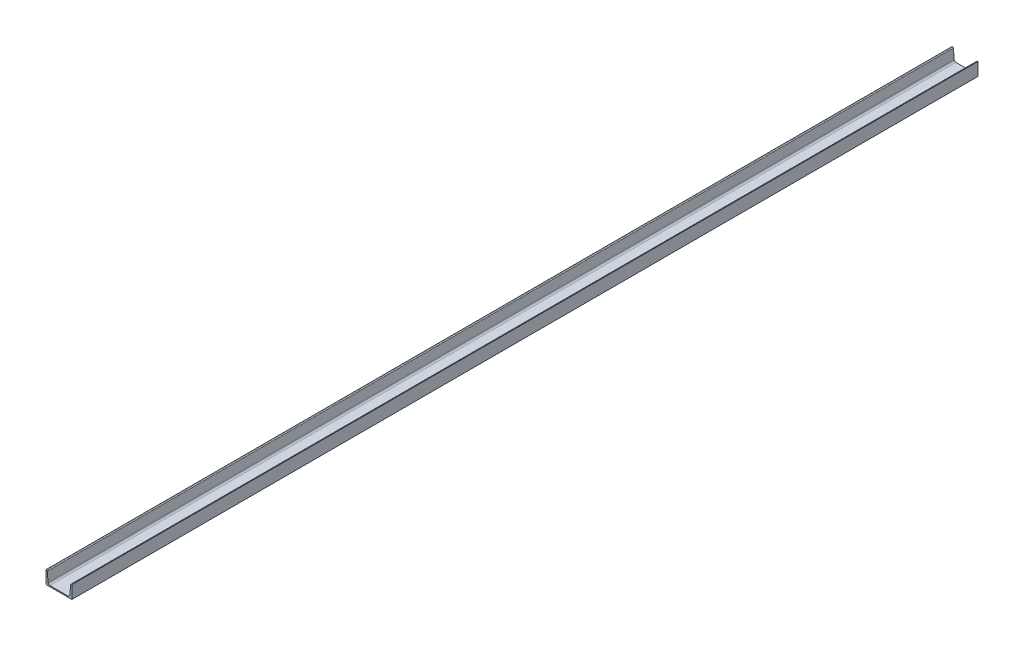
ISO-10303-21;
HEADER;
FILE_DESCRIPTION(('STEP AP214'),'2;1');
FILE_NAME('part.step','',(''),(''),'','','');
FILE_SCHEMA(('AUTOMOTIVE_DESIGN { 1 0 10303 214 1 1 1 1 }'));
ENDSEC;
DATA;
#1=APPLICATION_CONTEXT('core data for automotive mechanical design processes');
#2=APPLICATION_PROTOCOL_DEFINITION('international standard','automotive_design',2000,#1);
#3=PRODUCT_CONTEXT('',#1,'mechanical');
#4=PRODUCT('Part','Part','',(#3));
#5=PRODUCT_RELATED_PRODUCT_CATEGORY('part','',(#4));
#6=PRODUCT_DEFINITION_FORMATION('','',#4);
#7=PRODUCT_DEFINITION_CONTEXT('part definition',#1,'design');
#8=PRODUCT_DEFINITION('design','',#6,#7);
#9=PRODUCT_DEFINITION_SHAPE('','',#8);
#10=(LENGTH_UNIT() NAMED_UNIT(*) SI_UNIT(.MILLI.,.METRE.));
#11=(NAMED_UNIT(*) PLANE_ANGLE_UNIT() SI_UNIT($,.RADIAN.));
#12=(NAMED_UNIT(*) SI_UNIT($,.STERADIAN.) SOLID_ANGLE_UNIT());
#13=UNCERTAINTY_MEASURE_WITH_UNIT(LENGTH_MEASURE(1.E-05),#10,'distance_accuracy_value','');
#14=(GEOMETRIC_REPRESENTATION_CONTEXT(3) GLOBAL_UNCERTAINTY_ASSIGNED_CONTEXT((#13)) GLOBAL_UNIT_ASSIGNED_CONTEXT((#10,
#11,#12)) REPRESENTATION_CONTEXT('',''));
#15=CARTESIAN_POINT('',(0.,0.,0.));
#16=DIRECTION('',(0.,0.,1.));
#17=DIRECTION('',(1.,0.,0.));
#18=AXIS2_PLACEMENT_3D('',#15,#16,#17);
#19=CARTESIAN_POINT('',(147.57814259585,70.,-2625.));
#20=DIRECTION('',(0.,0.,1.));
#21=DIRECTION('',(1.,0.,0.));
#22=AXIS2_PLACEMENT_3D('',#19,#20,#21);
#23=CYLINDRICAL_SURFACE('',#22,4.99999999999999);
#24=CARTESIAN_POINT('',(147.57814259585,70.,2625.));
#25=DIRECTION('',(0.,0.,-1.));
#26=DIRECTION('',(-1.,0.,0.));
#27=AXIS2_PLACEMENT_3D('',#24,#25,#26);
#28=CIRCLE('',#27,4.99999999999999);
#29=CARTESIAN_POINT('',(142.597169105391,70.4357787137383,2625.));
#30=VERTEX_POINT('',#29);
#31=CARTESIAN_POINT('',(147.57814259585,75.,2625.));
#32=VERTEX_POINT('',#31);
#33=EDGE_CURVE('E195',#30,#32,#28,.T.);
#34=ORIENTED_EDGE('',*,*,#33,.T.);
#35=DIRECTION('',(0.,0.,1.));
#36=VECTOR('',#35,1.);
#37=CARTESIAN_POINT('',(147.57814259585,75.,-2625.));
#38=LINE('',#37,#36);
#39=CARTESIAN_POINT('',(147.57814259585,75.,-2625.));
#40=VERTEX_POINT('',#39);
#41=EDGE_CURVE('E13',#40,#32,#38,.T.);
#42=ORIENTED_EDGE('',*,*,#41,.F.);
#43=CARTESIAN_POINT('',(147.57814259585,70.,-2625.));
#44=DIRECTION('',(0.,0.,-1.));
#45=DIRECTION('',(-1.,0.,0.));
#46=AXIS2_PLACEMENT_3D('',#43,#44,#45);
#47=CIRCLE('',#46,4.99999999999999);
#48=CARTESIAN_POINT('',(142.597169105391,70.4357787137383,-2625.));
#49=VERTEX_POINT('',#48);
#50=EDGE_CURVE('E217',#49,#40,#47,.T.);
#51=ORIENTED_EDGE('',*,*,#50,.F.);
#52=DIRECTION('',(0.,0.,1.));
#53=VECTOR('',#52,1.);
#54=CARTESIAN_POINT('',(142.597169105391,70.4357787137383,-2625.));
#55=LINE('',#54,#53);
#56=EDGE_CURVE('E191',#49,#30,#55,.T.);
#57=ORIENTED_EDGE('',*,*,#56,.T.);
#58=EDGE_LOOP('',(#34,#42,#51,#57));
#59=FACE_BOUND('',#58,.T.);
#60=ADVANCED_FACE('F75',(#59),#23,.T.);
#61=CARTESIAN_POINT('',(150.,75.,-2625.));
#62=DIRECTION('',(0.,-1.,0.));
#63=DIRECTION('',(0.,0.,-1.));
#64=AXIS2_PLACEMENT_3D('',#61,#62,#63);
#65=PLANE('',#64);
#66=DIRECTION('',(1.,0.,0.));
#67=VECTOR('',#66,1.);
#68=CARTESIAN_POINT('',(150.,75.,2625.));
#69=LINE('',#68,#67);
#70=CARTESIAN_POINT('',(150.,75.,2625.));
#71=VERTEX_POINT('',#70);
#72=EDGE_CURVE('E198',#32,#71,#69,.T.);
#73=ORIENTED_EDGE('',*,*,#72,.T.);
#74=DIRECTION('',(0.,0.,1.));
#75=VECTOR('',#74,1.);
#76=CARTESIAN_POINT('',(150.,75.,-2625.));
#77=LINE('',#76,#75);
#78=CARTESIAN_POINT('',(150.,75.,-2625.));
#79=VERTEX_POINT('',#78);
#80=EDGE_CURVE('E83',#79,#71,#77,.T.);
#81=ORIENTED_EDGE('',*,*,#80,.F.);
#82=DIRECTION('',(1.,0.,0.));
#83=VECTOR('',#82,1.);
#84=CARTESIAN_POINT('',(150.,75.,-2625.));
#85=LINE('',#84,#83);
#86=EDGE_CURVE('E146',#40,#79,#85,.T.);
#87=ORIENTED_EDGE('',*,*,#86,.F.);
#88=ORIENTED_EDGE('',*,*,#41,.T.);
#89=EDGE_LOOP('',(#73,#81,#87,#88));
#90=FACE_BOUND('',#89,.T.);
#91=ADVANCED_FACE('F295',(#90),#65,.F.);
#92=CARTESIAN_POINT('',(150.,75.,-2625.));
#93=DIRECTION('',(-1.,0.,0.));
#94=DIRECTION('',(0.,0.,1.));
#95=AXIS2_PLACEMENT_3D('',#92,#93,#94);
#96=PLANE('',#95);
#97=DIRECTION('',(0.,-1.,0.));
#98=VECTOR('',#97,1.);
#99=CARTESIAN_POINT('',(150.,75.,2625.));
#100=LINE('',#99,#98);
#101=CARTESIAN_POINT('',(150.,0.,2625.));
#102=VERTEX_POINT('',#101);
#103=EDGE_CURVE('E200',#71,#102,#100,.T.);
#104=ORIENTED_EDGE('',*,*,#103,.T.);
#105=DIRECTION('',(0.,0.,1.));
#106=VECTOR('',#105,1.);
#107=CARTESIAN_POINT('',(150.,0.,-2625.));
#108=LINE('',#107,#106);
#109=CARTESIAN_POINT('',(150.,0.,-2625.));
#110=VERTEX_POINT('',#109);
#111=EDGE_CURVE('E236',#110,#102,#108,.T.);
#112=ORIENTED_EDGE('',*,*,#111,.F.);
#113=DIRECTION('',(0.,-1.,0.));
#114=VECTOR('',#113,1.);
#115=CARTESIAN_POINT('',(150.,75.,-2625.));
#116=LINE('',#115,#114);
#117=EDGE_CURVE('E244',#79,#110,#116,.T.);
#118=ORIENTED_EDGE('',*,*,#117,.F.);
#119=ORIENTED_EDGE('',*,*,#80,.T.);
#120=EDGE_LOOP('',(#104,#112,#118,#119));
#121=FACE_BOUND('',#120,.T.);
#122=ADVANCED_FACE('F242',(#121),#96,.F.);
#123=CARTESIAN_POINT('',(150.,0.,-2625.));
#124=DIRECTION('',(0.,1.,0.));
#125=DIRECTION('',(0.,0.,1.));
#126=AXIS2_PLACEMENT_3D('',#123,#124,#125);
#127=PLANE('',#126);
#128=DIRECTION('',(-1.,0.,0.));
#129=VECTOR('',#128,1.);
#130=CARTESIAN_POINT('',(150.,0.,2625.));
#131=LINE('',#130,#129);
#132=CARTESIAN_POINT('',(0.,0.,2625.));
#133=VERTEX_POINT('',#132);
#134=EDGE_CURVE('E202',#102,#133,#131,.T.);
#135=ORIENTED_EDGE('',*,*,#134,.T.);
#136=DIRECTION('',(0.,0.,1.));
#137=VECTOR('',#136,1.);
#138=CARTESIAN_POINT('',(0.,0.,-2625.));
#139=LINE('',#138,#137);
#140=CARTESIAN_POINT('',(0.,0.,-2625.));
#141=VERTEX_POINT('',#140);
#142=EDGE_CURVE('E233',#141,#133,#139,.T.);
#143=ORIENTED_EDGE('',*,*,#142,.F.);
#144=DIRECTION('',(-1.,0.,0.));
#145=VECTOR('',#144,1.);
#146=CARTESIAN_POINT('',(150.,0.,-2625.));
#147=LINE('',#146,#145);
#148=EDGE_CURVE('E262',#110,#141,#147,.T.);
#149=ORIENTED_EDGE('',*,*,#148,.F.);
#150=ORIENTED_EDGE('',*,*,#111,.T.);
#151=EDGE_LOOP('',(#135,#143,#149,#150));
#152=FACE_BOUND('',#151,.T.);
#153=ADVANCED_FACE('F253',(#152),#127,.F.);
#154=CARTESIAN_POINT('',(0.,75.,-2625.));
#155=DIRECTION('',(1.,0.,0.));
#156=DIRECTION('',(0.,1.,0.));
#157=AXIS2_PLACEMENT_3D('',#154,#155,#156);
#158=PLANE('',#157);
#159=DIRECTION('',(0.,1.,0.));
#160=VECTOR('',#159,1.);
#161=CARTESIAN_POINT('',(0.,75.,2625.));
#162=LINE('',#161,#160);
#163=CARTESIAN_POINT('',(0.,75.,2625.));
#164=VERTEX_POINT('',#163);
#165=EDGE_CURVE('E204',#133,#164,#162,.T.);
#166=ORIENTED_EDGE('',*,*,#165,.T.);
#167=DIRECTION('',(0.,0.,1.));
#168=VECTOR('',#167,1.);
#169=CARTESIAN_POINT('',(0.,75.,-2625.));
#170=LINE('',#169,#168);
#171=CARTESIAN_POINT('',(0.,75.,-2625.));
#172=VERTEX_POINT('',#171);
#173=EDGE_CURVE('E230',#172,#164,#170,.T.);
#174=ORIENTED_EDGE('',*,*,#173,.F.);
#175=DIRECTION('',(0.,1.,0.));
#176=VECTOR('',#175,1.);
#177=CARTESIAN_POINT('',(0.,75.,-2625.));
#178=LINE('',#177,#176);
#179=EDGE_CURVE('E259',#141,#172,#178,.T.);
#180=ORIENTED_EDGE('',*,*,#179,.F.);
#181=ORIENTED_EDGE('',*,*,#142,.T.);
#182=EDGE_LOOP('',(#166,#174,#180,#181));
#183=FACE_BOUND('',#182,.T.);
#184=ADVANCED_FACE('F257',(#183),#158,.F.);
#185=CARTESIAN_POINT('',(0.,75.,-2625.));
#186=DIRECTION('',(0.,-1.,0.));
#187=DIRECTION('',(0.,0.,-1.));
#188=AXIS2_PLACEMENT_3D('',#185,#186,#187);
#189=PLANE('',#188);
#190=DIRECTION('',(1.,0.,0.));
#191=VECTOR('',#190,1.);
#192=CARTESIAN_POINT('',(0.,75.,2625.));
#193=LINE('',#192,#191);
#194=CARTESIAN_POINT('',(2.42185740415013,75.,2625.));
#195=VERTEX_POINT('',#194);
#196=EDGE_CURVE('E206',#164,#195,#193,.T.);
#197=ORIENTED_EDGE('',*,*,#196,.T.);
#198=DIRECTION('',(0.,0.,1.));
#199=VECTOR('',#198,1.);
#200=CARTESIAN_POINT('',(2.42185740415013,75.,-2625.));
#201=LINE('',#200,#199);
#202=CARTESIAN_POINT('',(2.42185740415013,75.,-2625.));
#203=VERTEX_POINT('',#202);
#204=EDGE_CURVE('E227',#203,#195,#201,.T.);
#205=ORIENTED_EDGE('',*,*,#204,.F.);
#206=DIRECTION('',(1.,0.,0.));
#207=VECTOR('',#206,1.);
#208=CARTESIAN_POINT('',(0.,75.,-2625.));
#209=LINE('',#208,#207);
#210=EDGE_CURVE('E261',#172,#203,#209,.T.);
#211=ORIENTED_EDGE('',*,*,#210,.F.);
#212=ORIENTED_EDGE('',*,*,#173,.T.);
#213=EDGE_LOOP('',(#197,#205,#211,#212));
#214=FACE_BOUND('',#213,.T.);
#215=ADVANCED_FACE('F308',(#214),#189,.F.);
#216=CARTESIAN_POINT('',(2.42185740415013,70.,-2625.));
#217=DIRECTION('',(0.,0.,1.));
#218=DIRECTION('',(1.,0.,0.));
#219=AXIS2_PLACEMENT_3D('',#216,#217,#218);
#220=CYLINDRICAL_SURFACE('',#219,5.);
#221=CARTESIAN_POINT('',(2.42185740415013,70.,2625.));
#222=DIRECTION('',(0.,0.,-1.));
#223=DIRECTION('',(1.,0.,0.));
#224=AXIS2_PLACEMENT_3D('',#221,#222,#223);
#225=CIRCLE('',#224,5.);
#226=CARTESIAN_POINT('',(7.40283089460886,70.4357787137383,2625.));
#227=VERTEX_POINT('',#226);
#228=EDGE_CURVE('E208',#195,#227,#225,.T.);
#229=ORIENTED_EDGE('',*,*,#228,.T.);
#230=DIRECTION('',(0.,0.,1.));
#231=VECTOR('',#230,1.);
#232=CARTESIAN_POINT('',(7.40283089460886,70.4357787137383,-2625.));
#233=LINE('',#232,#231);
#234=CARTESIAN_POINT('',(7.40283089460886,70.4357787137383,-2625.));
#235=VERTEX_POINT('',#234);
#236=EDGE_CURVE('E224',#235,#227,#233,.T.);
#237=ORIENTED_EDGE('',*,*,#236,.F.);
#238=CARTESIAN_POINT('',(2.42185740415013,70.,-2625.));
#239=DIRECTION('',(0.,0.,-1.));
#240=DIRECTION('',(1.,0.,0.));
#241=AXIS2_PLACEMENT_3D('',#238,#239,#240);
#242=CIRCLE('',#241,5.);
#243=EDGE_CURVE('E264',#203,#235,#242,.T.);
#244=ORIENTED_EDGE('',*,*,#243,.F.);
#245=ORIENTED_EDGE('',*,*,#204,.T.);
#246=EDGE_LOOP('',(#229,#237,#244,#245));
#247=FACE_BOUND('',#246,.T.);
#248=ADVANCED_FACE('F311',(#247),#220,.T.);
#249=CARTESIAN_POINT('',(12.1978514850195,15.6284425725235,-2625.));
#250=DIRECTION('',(-0.996194698091746,-0.087155742747653,0.));
#251=DIRECTION('',(0.087155742747653,-0.996194698091746,0.));
#252=AXIS2_PLACEMENT_3D('',#249,#250,#251);
#253=PLANE('',#252);
#254=DIRECTION('',(0.087155742747653,-0.996194698091746,0.));
#255=VECTOR('',#254,1.);
#256=CARTESIAN_POINT('',(12.1978514850195,15.6284425725235,2625.));
#257=LINE('',#256,#255);
#258=CARTESIAN_POINT('',(12.1978514850195,15.6284425725235,2625.));
#259=VERTEX_POINT('',#258);
#260=EDGE_CURVE('E210',#227,#259,#257,.T.);
#261=ORIENTED_EDGE('',*,*,#260,.T.);
#262=DIRECTION('',(0.,0.,1.));
#263=VECTOR('',#262,1.);
#264=CARTESIAN_POINT('',(12.1978514850195,15.6284425725235,-2625.));
#265=LINE('',#264,#263);
#266=CARTESIAN_POINT('',(12.1978514850195,15.6284425725235,-2625.));
#267=VERTEX_POINT('',#266);
#268=EDGE_CURVE('E221',#267,#259,#265,.T.);
#269=ORIENTED_EDGE('',*,*,#268,.F.);
#270=DIRECTION('',(0.087155742747653,-0.996194698091746,0.));
#271=VECTOR('',#270,1.);
#272=CARTESIAN_POINT('',(12.1978514850195,15.6284425725235,-2625.));
#273=LINE('',#272,#271);
#274=EDGE_CURVE('E270',#235,#267,#273,.T.);
#275=ORIENTED_EDGE('',*,*,#274,.F.);
#276=ORIENTED_EDGE('',*,*,#236,.T.);
#277=EDGE_LOOP('',(#261,#269,#275,#276));
#278=FACE_BOUND('',#277,.T.);
#279=ADVANCED_FACE('F276',(#278),#253,.F.);
#280=CARTESIAN_POINT('',(22.159798465937,16.5,-2625.));
#281=DIRECTION('',(0.,0.,1.));
#282=DIRECTION('',(1.,0.,0.));
#283=AXIS2_PLACEMENT_3D('',#280,#281,#282);
#284=CYLINDRICAL_SURFACE('',#283,9.99999999999999);
#285=CARTESIAN_POINT('',(22.159798465937,16.5,2625.));
#286=DIRECTION('',(0.,0.,1.));
#287=DIRECTION('',(-1.,0.,0.));
#288=AXIS2_PLACEMENT_3D('',#285,#286,#287);
#289=CIRCLE('',#288,9.99999999999999);
#290=CARTESIAN_POINT('',(22.159798465937,6.50000000000004,2625.));
#291=VERTEX_POINT('',#290);
#292=EDGE_CURVE('E212',#259,#291,#289,.T.);
#293=ORIENTED_EDGE('',*,*,#292,.T.);
#294=DIRECTION('',(0.,0.,1.));
#295=VECTOR('',#294,1.);
#296=CARTESIAN_POINT('',(22.159798465937,6.50000000000004,-2625.));
#297=LINE('',#296,#295);
#298=CARTESIAN_POINT('',(22.159798465937,6.50000000000004,-2625.));
#299=VERTEX_POINT('',#298);
#300=EDGE_CURVE('E186',#299,#291,#297,.T.);
#301=ORIENTED_EDGE('',*,*,#300,.F.);
#302=CARTESIAN_POINT('',(22.159798465937,16.5,-2625.));
#303=DIRECTION('',(0.,0.,1.));
#304=DIRECTION('',(-1.,0.,0.));
#305=AXIS2_PLACEMENT_3D('',#302,#303,#304);
#306=CIRCLE('',#305,9.99999999999999);
#307=EDGE_CURVE('E177',#267,#299,#306,.T.);
#308=ORIENTED_EDGE('',*,*,#307,.F.);
#309=ORIENTED_EDGE('',*,*,#268,.T.);
#310=EDGE_LOOP('',(#293,#301,#308,#309));
#311=FACE_BOUND('',#310,.T.);
#312=ADVANCED_FACE('F280',(#311),#284,.F.);
#313=CARTESIAN_POINT('',(127.840201534063,6.50000000000001,-2625.));
#314=DIRECTION('',(0.,-1.,0.));
#315=DIRECTION('',(1.,0.,0.));
#316=AXIS2_PLACEMENT_3D('',#313,#314,#315);
#317=PLANE('',#316);
#318=DIRECTION('',(1.,0.,0.));
#319=VECTOR('',#318,1.);
#320=CARTESIAN_POINT('',(127.840201534063,6.50000000000001,2625.));
#321=LINE('',#320,#319);
#322=CARTESIAN_POINT('',(127.840201534063,6.50000000000001,2625.));
#323=VERTEX_POINT('',#322);
#324=EDGE_CURVE('E185',#291,#323,#321,.T.);
#325=ORIENTED_EDGE('',*,*,#324,.T.);
#326=DIRECTION('',(0.,0.,1.));
#327=VECTOR('',#326,1.);
#328=CARTESIAN_POINT('',(127.840201534063,6.50000000000001,-2625.));
#329=LINE('',#328,#327);
#330=CARTESIAN_POINT('',(127.840201534063,6.50000000000001,-2625.));
#331=VERTEX_POINT('',#330);
#332=EDGE_CURVE('E182',#331,#323,#329,.T.);
#333=ORIENTED_EDGE('',*,*,#332,.F.);
#334=DIRECTION('',(1.,0.,0.));
#335=VECTOR('',#334,1.);
#336=CARTESIAN_POINT('',(127.840201534063,6.50000000000001,-2625.));
#337=LINE('',#336,#335);
#338=EDGE_CURVE('E171',#299,#331,#337,.T.);
#339=ORIENTED_EDGE('',*,*,#338,.F.);
#340=ORIENTED_EDGE('',*,*,#300,.T.);
#341=EDGE_LOOP('',(#325,#333,#339,#340));
#342=FACE_BOUND('',#341,.T.);
#343=ADVANCED_FACE('F183',(#342),#317,.F.);
#344=CARTESIAN_POINT('',(127.840201534063,16.5,-2625.));
#345=DIRECTION('',(0.,0.,1.));
#346=DIRECTION('',(1.,0.,0.));
#347=AXIS2_PLACEMENT_3D('',#344,#345,#346);
#348=CYLINDRICAL_SURFACE('',#347,10.);
#349=CARTESIAN_POINT('',(127.840201534063,16.5,2625.));
#350=DIRECTION('',(0.,0.,1.));
#351=DIRECTION('',(1.,0.,0.));
#352=AXIS2_PLACEMENT_3D('',#349,#350,#351);
#353=CIRCLE('',#352,10.);
#354=CARTESIAN_POINT('',(137.802148514981,15.6284425725235,2625.));
#355=VERTEX_POINT('',#354);
#356=EDGE_CURVE('E132',#323,#355,#353,.T.);
#357=ORIENTED_EDGE('',*,*,#356,.T.);
#358=DIRECTION('',(0.,0.,1.));
#359=VECTOR('',#358,1.);
#360=CARTESIAN_POINT('',(137.802148514981,15.6284425725235,-2625.));
#361=LINE('',#360,#359);
#362=CARTESIAN_POINT('',(137.802148514981,15.6284425725235,-2625.));
#363=VERTEX_POINT('',#362);
#364=EDGE_CURVE('E187',#363,#355,#361,.T.);
#365=ORIENTED_EDGE('',*,*,#364,.F.);
#366=CARTESIAN_POINT('',(127.840201534063,16.5,-2625.));
#367=DIRECTION('',(0.,0.,1.));
#368=DIRECTION('',(1.,0.,0.));
#369=AXIS2_PLACEMENT_3D('',#366,#367,#368);
#370=CIRCLE('',#369,10.);
#371=EDGE_CURVE('E175',#331,#363,#370,.T.);
#372=ORIENTED_EDGE('',*,*,#371,.F.);
#373=ORIENTED_EDGE('',*,*,#332,.T.);
#374=EDGE_LOOP('',(#357,#365,#372,#373));
#375=FACE_BOUND('',#374,.T.);
#376=ADVANCED_FACE('F189',(#375),#348,.F.);
#377=CARTESIAN_POINT('',(137.802148514981,15.6284425725235,-2625.));
#378=DIRECTION('',(0.996194698091746,-0.0871557427476527,0.));
#379=DIRECTION('',(0.0871557427476527,0.996194698091746,0.));
#380=AXIS2_PLACEMENT_3D('',#377,#378,#379);
#381=PLANE('',#380);
#382=DIRECTION('',(0.0871557427476527,0.996194698091746,0.));
#383=VECTOR('',#382,1.);
#384=CARTESIAN_POINT('',(137.802148514981,15.6284425725235,2625.));
#385=LINE('',#384,#383);
#386=EDGE_CURVE('E138',#355,#30,#385,.T.);
#387=ORIENTED_EDGE('',*,*,#386,.T.);
#388=ORIENTED_EDGE('',*,*,#56,.F.);
#389=DIRECTION('',(0.0871557427476527,0.996194698091746,0.));
#390=VECTOR('',#389,1.);
#391=CARTESIAN_POINT('',(137.802148514981,15.6284425725235,-2625.));
#392=LINE('',#391,#390);
#393=EDGE_CURVE('E91',#363,#49,#392,.T.);
#394=ORIENTED_EDGE('',*,*,#393,.F.);
#395=ORIENTED_EDGE('',*,*,#364,.T.);
#396=EDGE_LOOP('',(#387,#388,#394,#395));
#397=FACE_BOUND('',#396,.T.);
#398=ADVANCED_FACE('F284',(#397),#381,.F.);
#399=CARTESIAN_POINT('',(147.57814259585,70.,-2625.));
#400=DIRECTION('',(0.,0.,-1.));
#401=DIRECTION('',(-1.,0.,0.));
#402=AXIS2_PLACEMENT_3D('',#399,#400,#401);
#403=PLANE('',#402);
#404=ORIENTED_EDGE('',*,*,#50,.T.);
#405=ORIENTED_EDGE('',*,*,#86,.T.);
#406=ORIENTED_EDGE('',*,*,#117,.T.);
#407=ORIENTED_EDGE('',*,*,#148,.T.);
#408=ORIENTED_EDGE('',*,*,#179,.T.);
#409=ORIENTED_EDGE('',*,*,#210,.T.);
#410=ORIENTED_EDGE('',*,*,#243,.T.);
#411=ORIENTED_EDGE('',*,*,#274,.T.);
#412=ORIENTED_EDGE('',*,*,#307,.T.);
#413=ORIENTED_EDGE('',*,*,#338,.T.);
#414=ORIENTED_EDGE('',*,*,#371,.T.);
#415=ORIENTED_EDGE('',*,*,#393,.T.);
#416=EDGE_LOOP('',(#404,#405,#406,#407,#408,#409,#410,#411,#412,#413,#414,#415));
#417=FACE_BOUND('',#416,.T.);
#418=ADVANCED_FACE('F173',(#417),#403,.T.);
#419=CARTESIAN_POINT('',(147.57814259585,70.,2625.));
#420=DIRECTION('',(0.,0.,-1.));
#421=DIRECTION('',(-1.,0.,0.));
#422=AXIS2_PLACEMENT_3D('',#419,#420,#421);
#423=PLANE('',#422);
#424=ORIENTED_EDGE('',*,*,#33,.F.);
#425=ORIENTED_EDGE('',*,*,#386,.F.);
#426=ORIENTED_EDGE('',*,*,#356,.F.);
#427=ORIENTED_EDGE('',*,*,#324,.F.);
#428=ORIENTED_EDGE('',*,*,#292,.F.);
#429=ORIENTED_EDGE('',*,*,#260,.F.);
#430=ORIENTED_EDGE('',*,*,#228,.F.);
#431=ORIENTED_EDGE('',*,*,#196,.F.);
#432=ORIENTED_EDGE('',*,*,#165,.F.);
#433=ORIENTED_EDGE('',*,*,#134,.F.);
#434=ORIENTED_EDGE('',*,*,#103,.F.);
#435=ORIENTED_EDGE('',*,*,#72,.F.);
#436=EDGE_LOOP('',(#424,#425,#426,#427,#428,#429,#430,#431,#432,#433,#434,#435));
#437=FACE_BOUND('',#436,.T.);
#438=ADVANCED_FACE('F248',(#437),#423,.F.);
#439=CLOSED_SHELL('',(#60,#91,#122,#153,#184,#215,#248,#279,#312,#343,#376,#398,#418,#438));
#440=MANIFOLD_SOLID_BREP('B2',#439);
#441=ADVANCED_BREP_SHAPE_REPRESENTATION('',(#18,#440),#14);
#442=SHAPE_DEFINITION_REPRESENTATION(#9,#441);
ENDSEC;
END-ISO-10303-21;
